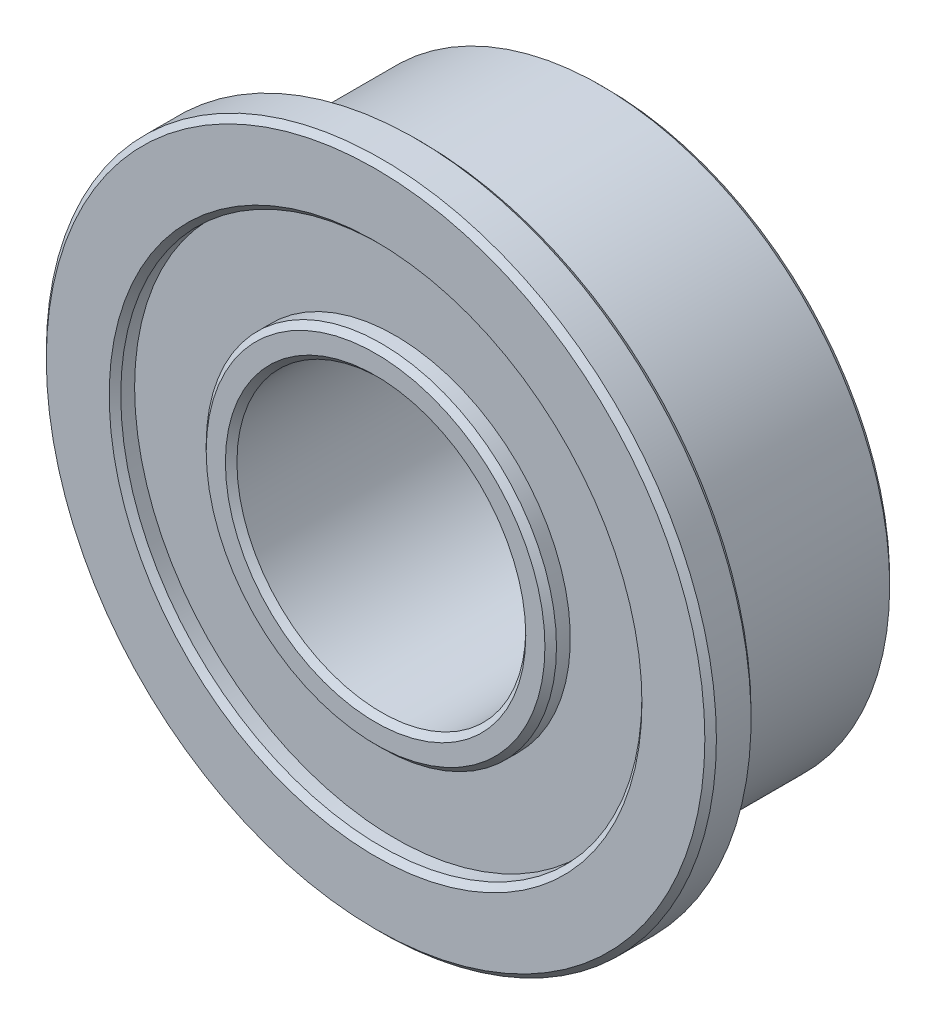
ISO-10303-21;
HEADER;
FILE_DESCRIPTION(('STEP AP214'),'2;1');
FILE_NAME('part.step','',(''),(''),'','','');
FILE_SCHEMA(('AUTOMOTIVE_DESIGN { 1 0 10303 214 1 1 1 1 }'));
ENDSEC;
DATA;
#1=APPLICATION_CONTEXT('core data for automotive mechanical design processes');
#2=APPLICATION_PROTOCOL_DEFINITION('international standard','automotive_design',2000,#1);
#3=PRODUCT_CONTEXT('',#1,'mechanical');
#4=PRODUCT('Part','Part','',(#3));
#5=PRODUCT_RELATED_PRODUCT_CATEGORY('part','',(#4));
#6=PRODUCT_DEFINITION_FORMATION('','',#4);
#7=PRODUCT_DEFINITION_CONTEXT('part definition',#1,'design');
#8=PRODUCT_DEFINITION('design','',#6,#7);
#9=PRODUCT_DEFINITION_SHAPE('','',#8);
#10=(LENGTH_UNIT() NAMED_UNIT(*) SI_UNIT(.MILLI.,.METRE.));
#11=(NAMED_UNIT(*) PLANE_ANGLE_UNIT() SI_UNIT($,.RADIAN.));
#12=(NAMED_UNIT(*) SI_UNIT($,.STERADIAN.) SOLID_ANGLE_UNIT());
#13=UNCERTAINTY_MEASURE_WITH_UNIT(LENGTH_MEASURE(1.E-05),#10,'distance_accuracy_value','');
#14=(GEOMETRIC_REPRESENTATION_CONTEXT(3) GLOBAL_UNCERTAINTY_ASSIGNED_CONTEXT((#13)) GLOBAL_UNIT_ASSIGNED_CONTEXT((#10,
#11,#12)) REPRESENTATION_CONTEXT('',''));
#15=CARTESIAN_POINT('',(0.,0.,0.));
#16=DIRECTION('',(0.,0.,1.));
#17=DIRECTION('',(1.,0.,0.));
#18=AXIS2_PLACEMENT_3D('',#15,#16,#17);
#19=CARTESIAN_POINT('',(0.,3.03183851121958,-2.));
#20=DIRECTION('',(0.,0.,-1.));
#21=DIRECTION('',(-1.,0.,0.));
#22=AXIS2_PLACEMENT_3D('',#19,#20,#21);
#23=PLANE('',#22);
#24=CARTESIAN_POINT('',(0.,0.,-2.));
#25=DIRECTION('',(0.,0.,-1.));
#26=DIRECTION('',(-1.,0.,0.));
#27=AXIS2_PLACEMENT_3D('',#24,#25,#26);
#28=CIRCLE('',#27,2.93183851121958);
#29=CARTESIAN_POINT('',(-2.93183851121958,0.,-2.));
#30=VERTEX_POINT('',#29);
#31=EDGE_CURVE('E62',#30,#30,#28,.T.);
#32=ORIENTED_EDGE('',*,*,#31,.T.);
#33=EDGE_LOOP('',(#32));
#34=FACE_BOUND('',#33,.T.);
#35=CARTESIAN_POINT('',(0.,0.,-2.));
#36=DIRECTION('',(0.,0.,-1.));
#37=DIRECTION('',(-1.,0.,0.));
#38=AXIS2_PLACEMENT_3D('',#35,#36,#37);
#39=CIRCLE('',#38,2.59999999999999);
#40=CARTESIAN_POINT('',(-2.59999999999999,0.,-2.));
#41=VERTEX_POINT('',#40);
#42=EDGE_CURVE('E65',#41,#41,#39,.F.);
#43=ORIENTED_EDGE('',*,*,#42,.T.);
#44=EDGE_LOOP('',(#43));
#45=FACE_BOUND('',#44,.T.);
#46=ADVANCED_FACE('F33',(#34,#45),#23,.T.);
#47=CARTESIAN_POINT('',(0.,0.,-19.0782719959034));
#48=DIRECTION('',(0.,0.,-1.));
#49=DIRECTION('',(-1.,0.,0.));
#50=AXIS2_PLACEMENT_3D('',#47,#48,#49);
#51=CYLINDRICAL_SURFACE('',#50,3.03183851121958);
#52=CARTESIAN_POINT('',(0.,0.,-1.9));
#53=DIRECTION('',(0.,0.,-1.));
#54=DIRECTION('',(-1.,0.,0.));
#55=AXIS2_PLACEMENT_3D('',#52,#53,#54);
#56=CIRCLE('',#55,3.03183851121958);
#57=CARTESIAN_POINT('',(-3.03183851121958,0.,-1.9));
#58=VERTEX_POINT('',#57);
#59=EDGE_CURVE('E59',#58,#58,#56,.F.);
#60=ORIENTED_EDGE('',*,*,#59,.T.);
#61=EDGE_LOOP('',(#60));
#62=FACE_BOUND('',#61,.T.);
#63=CARTESIAN_POINT('',(0.,0.,-1.6603253707757));
#64=DIRECTION('',(0.,0.,-1.));
#65=DIRECTION('',(-1.,0.,0.));
#66=AXIS2_PLACEMENT_3D('',#63,#64,#65);
#67=CIRCLE('',#66,3.03183851121958);
#68=CARTESIAN_POINT('',(-3.03183851121958,0.,-1.6603253707757));
#69=VERTEX_POINT('',#68);
#70=EDGE_CURVE('E95',#69,#69,#67,.T.);
#71=ORIENTED_EDGE('',*,*,#70,.T.);
#72=EDGE_LOOP('',(#71));
#73=FACE_BOUND('',#72,.T.);
#74=ADVANCED_FACE('F129',(#62,#73),#51,.T.);
#75=CARTESIAN_POINT('',(0.,4.51099571266411,-1.6603253707757));
#76=DIRECTION('',(0.,0.,-1.));
#77=DIRECTION('',(-1.,0.,0.));
#78=AXIS2_PLACEMENT_3D('',#75,#76,#77);
#79=PLANE('',#78);
#80=CARTESIAN_POINT('',(0.,0.,-1.6603253707757));
#81=DIRECTION('',(0.,0.,-1.));
#82=DIRECTION('',(-1.,0.,0.));
#83=AXIS2_PLACEMENT_3D('',#80,#81,#82);
#84=CIRCLE('',#83,4.51099571266411);
#85=CARTESIAN_POINT('',(-4.51099571266411,0.,-1.6603253707757));
#86=VERTEX_POINT('',#85);
#87=EDGE_CURVE('E98',#86,#86,#84,.T.);
#88=ORIENTED_EDGE('',*,*,#87,.T.);
#89=EDGE_LOOP('',(#88));
#90=FACE_BOUND('',#89,.T.);
#91=ORIENTED_EDGE('',*,*,#70,.F.);
#92=EDGE_LOOP('',(#91));
#93=FACE_BOUND('',#92,.T.);
#94=ADVANCED_FACE('F135',(#90,#93),#79,.T.);
#95=CARTESIAN_POINT('',(0.,0.,-19.0782719959034));
#96=DIRECTION('',(0.,0.,-1.));
#97=DIRECTION('',(-1.,0.,0.));
#98=AXIS2_PLACEMENT_3D('',#95,#96,#97);
#99=CYLINDRICAL_SURFACE('',#98,4.51099571266411);
#100=CARTESIAN_POINT('',(0.,0.,-1.9));
#101=DIRECTION('',(0.,0.,-1.));
#102=DIRECTION('',(-1.,0.,0.));
#103=AXIS2_PLACEMENT_3D('',#100,#101,#102);
#104=CIRCLE('',#103,4.51099571266411);
#105=CARTESIAN_POINT('',(-4.51099571266411,0.,-1.9));
#106=VERTEX_POINT('',#105);
#107=EDGE_CURVE('E74',#106,#106,#104,.T.);
#108=ORIENTED_EDGE('',*,*,#107,.T.);
#109=EDGE_LOOP('',(#108));
#110=FACE_BOUND('',#109,.T.);
#111=ORIENTED_EDGE('',*,*,#87,.F.);
#112=EDGE_LOOP('',(#111));
#113=FACE_BOUND('',#112,.T.);
#114=ADVANCED_FACE('F307',(#110,#113),#99,.F.);
#115=CARTESIAN_POINT('',(0.,5.,-2.));
#116=DIRECTION('',(0.,0.,-1.));
#117=DIRECTION('',(-1.,0.,0.));
#118=AXIS2_PLACEMENT_3D('',#115,#116,#117);
#119=PLANE('',#118);
#120=CARTESIAN_POINT('',(0.,0.,-2.));
#121=DIRECTION('',(0.,0.,-1.));
#122=DIRECTION('',(-1.,0.,0.));
#123=AXIS2_PLACEMENT_3D('',#120,#121,#122);
#124=CIRCLE('',#123,4.61099571266411);
#125=CARTESIAN_POINT('',(-4.61099571266411,0.,-2.));
#126=VERTEX_POINT('',#125);
#127=EDGE_CURVE('E68',#126,#126,#124,.F.);
#128=ORIENTED_EDGE('',*,*,#127,.T.);
#129=EDGE_LOOP('',(#128));
#130=FACE_BOUND('',#129,.T.);
#131=CARTESIAN_POINT('',(0.,0.,-2.));
#132=DIRECTION('',(0.,0.,-1.));
#133=DIRECTION('',(-1.,0.,0.));
#134=AXIS2_PLACEMENT_3D('',#131,#132,#133);
#135=CIRCLE('',#134,4.9);
#136=CARTESIAN_POINT('',(-4.9,0.,-2.));
#137=VERTEX_POINT('',#136);
#138=EDGE_CURVE('E71',#137,#137,#135,.T.);
#139=ORIENTED_EDGE('',*,*,#138,.T.);
#140=EDGE_LOOP('',(#139));
#141=FACE_BOUND('',#140,.T.);
#142=ADVANCED_FACE('F299',(#130,#141),#119,.T.);
#143=CARTESIAN_POINT('',(0.,0.,-19.0782719959034));
#144=DIRECTION('',(0.,0.,-1.));
#145=DIRECTION('',(-1.,0.,0.));
#146=AXIS2_PLACEMENT_3D('',#143,#144,#145);
#147=CYLINDRICAL_SURFACE('',#146,5.);
#148=CARTESIAN_POINT('',(0.,0.,-1.9));
#149=DIRECTION('',(0.,0.,-1.));
#150=DIRECTION('',(-1.,0.,0.));
#151=AXIS2_PLACEMENT_3D('',#148,#149,#150);
#152=CIRCLE('',#151,5.);
#153=CARTESIAN_POINT('',(-5.,0.,-1.9));
#154=VERTEX_POINT('',#153);
#155=EDGE_CURVE('E10',#154,#154,#152,.F.);
#156=ORIENTED_EDGE('',*,*,#155,.T.);
#157=EDGE_LOOP('',(#156));
#158=FACE_BOUND('',#157,.T.);
#159=CARTESIAN_POINT('',(0.,0.,1.2));
#160=DIRECTION('',(0.,0.,-1.));
#161=DIRECTION('',(-1.,0.,0.));
#162=AXIS2_PLACEMENT_3D('',#159,#160,#161);
#163=CIRCLE('',#162,5.);
#164=CARTESIAN_POINT('',(-5.,0.,1.2));
#165=VERTEX_POINT('',#164);
#166=EDGE_CURVE('E101',#165,#165,#163,.T.);
#167=ORIENTED_EDGE('',*,*,#166,.T.);
#168=EDGE_LOOP('',(#167));
#169=FACE_BOUND('',#168,.T.);
#170=ADVANCED_FACE('F290',(#158,#169),#147,.T.);
#171=CARTESIAN_POINT('',(0.,5.,1.2));
#172=DIRECTION('',(0.,0.,-1.));
#173=DIRECTION('',(-1.,0.,0.));
#174=AXIS2_PLACEMENT_3D('',#171,#172,#173);
#175=PLANE('',#174);
#176=CARTESIAN_POINT('',(0.,0.,1.2));
#177=DIRECTION('',(0.,0.,-1.));
#178=DIRECTION('',(-1.,0.,0.));
#179=AXIS2_PLACEMENT_3D('',#176,#177,#178);
#180=CIRCLE('',#179,5.70000000000001);
#181=CARTESIAN_POINT('',(-5.70000000000001,0.,1.2));
#182=VERTEX_POINT('',#181);
#183=EDGE_CURVE('E83',#182,#182,#180,.T.);
#184=ORIENTED_EDGE('',*,*,#183,.T.);
#185=EDGE_LOOP('',(#184));
#186=FACE_BOUND('',#185,.T.);
#187=ORIENTED_EDGE('',*,*,#166,.F.);
#188=EDGE_LOOP('',(#187));
#189=FACE_BOUND('',#188,.T.);
#190=ADVANCED_FACE('F281',(#186,#189),#175,.T.);
#191=CARTESIAN_POINT('',(0.,0.,-19.0782719959034));
#192=DIRECTION('',(0.,0.,-1.));
#193=DIRECTION('',(-1.,0.,0.));
#194=AXIS2_PLACEMENT_3D('',#191,#192,#193);
#195=CYLINDRICAL_SURFACE('',#194,5.8);
#196=CARTESIAN_POINT('',(0.,0.,1.3));
#197=DIRECTION('',(0.,0.,-1.));
#198=DIRECTION('',(-1.,0.,0.));
#199=AXIS2_PLACEMENT_3D('',#196,#197,#198);
#200=CIRCLE('',#199,5.8);
#201=CARTESIAN_POINT('',(-5.8,0.,1.3));
#202=VERTEX_POINT('',#201);
#203=EDGE_CURVE('E77',#202,#202,#200,.F.);
#204=ORIENTED_EDGE('',*,*,#203,.T.);
#205=EDGE_LOOP('',(#204));
#206=FACE_BOUND('',#205,.T.);
#207=CARTESIAN_POINT('',(0.,0.,1.90000000000001));
#208=DIRECTION('',(0.,0.,1.));
#209=DIRECTION('',(1.,0.,0.));
#210=AXIS2_PLACEMENT_3D('',#207,#208,#209);
#211=CIRCLE('',#210,5.8);
#212=CARTESIAN_POINT('',(5.8,0.,1.90000000000001));
#213=VERTEX_POINT('',#212);
#214=EDGE_CURVE('E80',#213,#213,#211,.F.);
#215=ORIENTED_EDGE('',*,*,#214,.T.);
#216=EDGE_LOOP('',(#215));
#217=FACE_BOUND('',#216,.T.);
#218=ADVANCED_FACE('F272',(#206,#217),#195,.T.);
#219=CARTESIAN_POINT('',(0.,5.8,2.));
#220=DIRECTION('',(0.,0.,1.));
#221=DIRECTION('',(1.,0.,0.));
#222=AXIS2_PLACEMENT_3D('',#219,#220,#221);
#223=PLANE('',#222);
#224=CARTESIAN_POINT('',(0.,0.,2.));
#225=DIRECTION('',(0.,0.,1.));
#226=DIRECTION('',(1.,0.,0.));
#227=AXIS2_PLACEMENT_3D('',#224,#225,#226);
#228=CIRCLE('',#227,4.61099571266411);
#229=CARTESIAN_POINT('',(4.61099571266411,0.,2.));
#230=VERTEX_POINT('',#229);
#231=EDGE_CURVE('E89',#230,#230,#228,.F.);
#232=ORIENTED_EDGE('',*,*,#231,.T.);
#233=EDGE_LOOP('',(#232));
#234=FACE_BOUND('',#233,.T.);
#235=CARTESIAN_POINT('',(0.,0.,2.));
#236=DIRECTION('',(0.,0.,1.));
#237=DIRECTION('',(1.,0.,0.));
#238=AXIS2_PLACEMENT_3D('',#235,#236,#237);
#239=CIRCLE('',#238,5.70000000000001);
#240=CARTESIAN_POINT('',(5.70000000000001,0.,2.));
#241=VERTEX_POINT('',#240);
#242=EDGE_CURVE('E92',#241,#241,#239,.T.);
#243=ORIENTED_EDGE('',*,*,#242,.T.);
#244=EDGE_LOOP('',(#243));
#245=FACE_BOUND('',#244,.T.);
#246=ADVANCED_FACE('F263',(#234,#245),#223,.T.);
#247=CARTESIAN_POINT('',(0.,0.,-19.0782719959034));
#248=DIRECTION('',(0.,0.,-1.));
#249=DIRECTION('',(-1.,0.,0.));
#250=AXIS2_PLACEMENT_3D('',#247,#248,#249);
#251=CYLINDRICAL_SURFACE('',#250,4.51099571266411);
#252=CARTESIAN_POINT('',(0.,0.,1.9));
#253=DIRECTION('',(0.,0.,1.));
#254=DIRECTION('',(1.,0.,0.));
#255=AXIS2_PLACEMENT_3D('',#252,#253,#254);
#256=CIRCLE('',#255,4.51099571266411);
#257=CARTESIAN_POINT('',(4.51099571266411,0.,1.9));
#258=VERTEX_POINT('',#257);
#259=EDGE_CURVE('E86',#258,#258,#256,.T.);
#260=ORIENTED_EDGE('',*,*,#259,.T.);
#261=EDGE_LOOP('',(#260));
#262=FACE_BOUND('',#261,.T.);
#263=CARTESIAN_POINT('',(0.,0.,1.6603253707757));
#264=DIRECTION('',(0.,0.,-1.));
#265=DIRECTION('',(-1.,0.,0.));
#266=AXIS2_PLACEMENT_3D('',#263,#264,#265);
#267=CIRCLE('',#266,4.51099571266411);
#268=CARTESIAN_POINT('',(-4.51099571266411,0.,1.6603253707757));
#269=VERTEX_POINT('',#268);
#270=EDGE_CURVE('E104',#269,#269,#267,.T.);
#271=ORIENTED_EDGE('',*,*,#270,.T.);
#272=EDGE_LOOP('',(#271));
#273=FACE_BOUND('',#272,.T.);
#274=ADVANCED_FACE('F126',(#262,#273),#251,.F.);
#275=CARTESIAN_POINT('',(0.,4.51099571266411,1.6603253707757));
#276=DIRECTION('',(0.,0.,1.));
#277=DIRECTION('',(1.,0.,0.));
#278=AXIS2_PLACEMENT_3D('',#275,#276,#277);
#279=PLANE('',#278);
#280=CARTESIAN_POINT('',(0.,0.,1.6603253707757));
#281=DIRECTION('',(0.,0.,-1.));
#282=DIRECTION('',(-1.,0.,0.));
#283=AXIS2_PLACEMENT_3D('',#280,#281,#282);
#284=CIRCLE('',#283,3.03183851121958);
#285=CARTESIAN_POINT('',(-3.03183851121958,0.,1.6603253707757));
#286=VERTEX_POINT('',#285);
#287=EDGE_CURVE('E107',#286,#286,#284,.T.);
#288=ORIENTED_EDGE('',*,*,#287,.T.);
#289=EDGE_LOOP('',(#288));
#290=FACE_BOUND('',#289,.T.);
#291=ORIENTED_EDGE('',*,*,#270,.F.);
#292=EDGE_LOOP('',(#291));
#293=FACE_BOUND('',#292,.T.);
#294=ADVANCED_FACE('F111',(#290,#293),#279,.T.);
#295=CARTESIAN_POINT('',(0.,0.,-19.0782719959034));
#296=DIRECTION('',(0.,0.,-1.));
#297=DIRECTION('',(-1.,0.,0.));
#298=AXIS2_PLACEMENT_3D('',#295,#296,#297);
#299=CYLINDRICAL_SURFACE('',#298,3.03183851121958);
#300=CARTESIAN_POINT('',(0.,0.,1.90000000000001));
#301=DIRECTION('',(0.,0.,1.));
#302=DIRECTION('',(1.,0.,0.));
#303=AXIS2_PLACEMENT_3D('',#300,#301,#302);
#304=CIRCLE('',#303,3.03183851121958);
#305=CARTESIAN_POINT('',(3.03183851121958,0.,1.90000000000001));
#306=VERTEX_POINT('',#305);
#307=EDGE_CURVE('E56',#306,#306,#304,.F.);
#308=ORIENTED_EDGE('',*,*,#307,.T.);
#309=EDGE_LOOP('',(#308));
#310=FACE_BOUND('',#309,.T.);
#311=ORIENTED_EDGE('',*,*,#287,.F.);
#312=EDGE_LOOP('',(#311));
#313=FACE_BOUND('',#312,.T.);
#314=ADVANCED_FACE('F114',(#310,#313),#299,.T.);
#315=CARTESIAN_POINT('',(0.,3.03183851121958,2.));
#316=DIRECTION('',(0.,0.,1.));
#317=DIRECTION('',(1.,0.,0.));
#318=AXIS2_PLACEMENT_3D('',#315,#316,#317);
#319=PLANE('',#318);
#320=CARTESIAN_POINT('',(0.,0.,2.));
#321=DIRECTION('',(0.,0.,1.));
#322=DIRECTION('',(1.,0.,0.));
#323=AXIS2_PLACEMENT_3D('',#320,#321,#322);
#324=CIRCLE('',#323,2.93183851121958);
#325=CARTESIAN_POINT('',(2.93183851121958,0.,2.));
#326=VERTEX_POINT('',#325);
#327=EDGE_CURVE('E48',#326,#326,#324,.T.);
#328=ORIENTED_EDGE('',*,*,#327,.T.);
#329=EDGE_LOOP('',(#328));
#330=FACE_BOUND('',#329,.T.);
#331=CARTESIAN_POINT('',(0.,0.,2.));
#332=DIRECTION('',(0.,0.,1.));
#333=DIRECTION('',(1.,0.,0.));
#334=AXIS2_PLACEMENT_3D('',#331,#332,#333);
#335=CIRCLE('',#334,2.59999999999999);
#336=CARTESIAN_POINT('',(2.59999999999999,0.,2.));
#337=VERTEX_POINT('',#336);
#338=EDGE_CURVE('E53',#337,#337,#335,.F.);
#339=ORIENTED_EDGE('',*,*,#338,.T.);
#340=EDGE_LOOP('',(#339));
#341=FACE_BOUND('',#340,.T.);
#342=ADVANCED_FACE('F116',(#330,#341),#319,.T.);
#343=CARTESIAN_POINT('',(0.,0.,-19.0782719959034));
#344=DIRECTION('',(0.,0.,-1.));
#345=DIRECTION('',(-1.,0.,0.));
#346=AXIS2_PLACEMENT_3D('',#343,#344,#345);
#347=CYLINDRICAL_SURFACE('',#346,2.5);
#348=CARTESIAN_POINT('',(0.,0.,-1.90000000000001));
#349=DIRECTION('',(0.,0.,-1.));
#350=DIRECTION('',(-1.,0.,0.));
#351=AXIS2_PLACEMENT_3D('',#348,#349,#350);
#352=CIRCLE('',#351,2.5);
#353=CARTESIAN_POINT('',(-2.5,0.,-1.90000000000001));
#354=VERTEX_POINT('',#353);
#355=EDGE_CURVE('E40',#354,#354,#352,.T.);
#356=ORIENTED_EDGE('',*,*,#355,.T.);
#357=EDGE_LOOP('',(#356));
#358=FACE_BOUND('',#357,.T.);
#359=CARTESIAN_POINT('',(0.,0.,1.9));
#360=DIRECTION('',(0.,0.,1.));
#361=DIRECTION('',(1.,0.,0.));
#362=AXIS2_PLACEMENT_3D('',#359,#360,#361);
#363=CIRCLE('',#362,2.5);
#364=CARTESIAN_POINT('',(2.5,0.,1.9));
#365=VERTEX_POINT('',#364);
#366=EDGE_CURVE('E44',#365,#365,#363,.T.);
#367=ORIENTED_EDGE('',*,*,#366,.T.);
#368=EDGE_LOOP('',(#367));
#369=FACE_BOUND('',#368,.T.);
#370=ADVANCED_FACE('F123',(#358,#369),#347,.F.);
#371=CARTESIAN_POINT('',(0.,0.,2.));
#372=DIRECTION('',(0.,0.,1.));
#373=DIRECTION('',(1.,0.,0.));
#374=AXIS2_PLACEMENT_3D('',#371,#372,#373);
#375=CONICAL_SURFACE('',#374,4.61099571266411,0.78539816339744);
#376=ORIENTED_EDGE('',*,*,#259,.F.);
#377=EDGE_LOOP('',(#376));
#378=FACE_BOUND('',#377,.T.);
#379=ORIENTED_EDGE('',*,*,#231,.F.);
#380=EDGE_LOOP('',(#379));
#381=FACE_BOUND('',#380,.T.);
#382=ADVANCED_FACE('F141',(#378,#381),#375,.F.);
#383=CARTESIAN_POINT('',(0.,0.,1.2));
#384=DIRECTION('',(0.,0.,1.));
#385=DIRECTION('',(1.,0.,0.));
#386=AXIS2_PLACEMENT_3D('',#383,#384,#385);
#387=CONICAL_SURFACE('',#386,5.70000000000001,0.78539816339744);
#388=ORIENTED_EDGE('',*,*,#203,.F.);
#389=EDGE_LOOP('',(#388));
#390=FACE_BOUND('',#389,.T.);
#391=ORIENTED_EDGE('',*,*,#183,.F.);
#392=EDGE_LOOP('',(#391));
#393=FACE_BOUND('',#392,.T.);
#394=ADVANCED_FACE('F144',(#390,#393),#387,.T.);
#395=CARTESIAN_POINT('',(0.,0.,1.90000000000001));
#396=DIRECTION('',(0.,0.,-1.));
#397=DIRECTION('',(-1.,0.,0.));
#398=AXIS2_PLACEMENT_3D('',#395,#396,#397);
#399=CONICAL_SURFACE('',#398,5.8,0.785398163397444);
#400=ORIENTED_EDGE('',*,*,#242,.F.);
#401=EDGE_LOOP('',(#400));
#402=FACE_BOUND('',#401,.T.);
#403=ORIENTED_EDGE('',*,*,#214,.F.);
#404=EDGE_LOOP('',(#403));
#405=FACE_BOUND('',#404,.T.);
#406=ADVANCED_FACE('F148',(#402,#405),#399,.T.);
#407=CARTESIAN_POINT('',(0.,0.,-1.9));
#408=DIRECTION('',(0.,0.,-1.));
#409=DIRECTION('',(-1.,0.,0.));
#410=AXIS2_PLACEMENT_3D('',#407,#408,#409);
#411=CONICAL_SURFACE('',#410,4.51099571266411,0.78539816339744);
#412=ORIENTED_EDGE('',*,*,#127,.F.);
#413=EDGE_LOOP('',(#412));
#414=FACE_BOUND('',#413,.T.);
#415=ORIENTED_EDGE('',*,*,#107,.F.);
#416=EDGE_LOOP('',(#415));
#417=FACE_BOUND('',#416,.T.);
#418=ADVANCED_FACE('F152',(#414,#417),#411,.F.);
#419=CARTESIAN_POINT('',(0.,0.,-2.));
#420=DIRECTION('',(0.,0.,1.));
#421=DIRECTION('',(1.,0.,0.));
#422=AXIS2_PLACEMENT_3D('',#419,#420,#421);
#423=CONICAL_SURFACE('',#422,2.93183851121958,0.785398163397422);
#424=ORIENTED_EDGE('',*,*,#59,.F.);
#425=EDGE_LOOP('',(#424));
#426=FACE_BOUND('',#425,.T.);
#427=ORIENTED_EDGE('',*,*,#31,.F.);
#428=EDGE_LOOP('',(#427));
#429=FACE_BOUND('',#428,.T.);
#430=ADVANCED_FACE('F156',(#426,#429),#423,.T.);
#431=CARTESIAN_POINT('',(0.,0.,1.90000000000001));
#432=DIRECTION('',(0.,0.,-1.));
#433=DIRECTION('',(-1.,0.,0.));
#434=AXIS2_PLACEMENT_3D('',#431,#432,#433);
#435=CONICAL_SURFACE('',#434,3.03183851121958,0.785398163397442);
#436=ORIENTED_EDGE('',*,*,#327,.F.);
#437=EDGE_LOOP('',(#436));
#438=FACE_BOUND('',#437,.T.);
#439=ORIENTED_EDGE('',*,*,#307,.F.);
#440=EDGE_LOOP('',(#439));
#441=FACE_BOUND('',#440,.T.);
#442=ADVANCED_FACE('F160',(#438,#441),#435,.T.);
#443=CARTESIAN_POINT('',(0.,0.,-1.90000000000001));
#444=DIRECTION('',(0.,0.,-1.));
#445=DIRECTION('',(-1.,0.,0.));
#446=AXIS2_PLACEMENT_3D('',#443,#444,#445);
#447=CONICAL_SURFACE('',#446,2.5,0.785398163397448);
#448=ORIENTED_EDGE('',*,*,#42,.F.);
#449=EDGE_LOOP('',(#448));
#450=FACE_BOUND('',#449,.T.);
#451=ORIENTED_EDGE('',*,*,#355,.F.);
#452=EDGE_LOOP('',(#451));
#453=FACE_BOUND('',#452,.T.);
#454=ADVANCED_FACE('F164',(#450,#453),#447,.F.);
#455=CARTESIAN_POINT('',(0.,0.,2.));
#456=DIRECTION('',(0.,0.,1.));
#457=DIRECTION('',(1.,0.,0.));
#458=AXIS2_PLACEMENT_3D('',#455,#456,#457);
#459=CONICAL_SURFACE('',#458,2.6,0.785398163397431);
#460=ORIENTED_EDGE('',*,*,#366,.F.);
#461=EDGE_LOOP('',(#460));
#462=FACE_BOUND('',#461,.T.);
#463=ORIENTED_EDGE('',*,*,#338,.F.);
#464=EDGE_LOOP('',(#463));
#465=FACE_BOUND('',#464,.T.);
#466=ADVANCED_FACE('F167',(#462,#465),#459,.F.);
#467=CARTESIAN_POINT('',(0.,0.,-2.));
#468=DIRECTION('',(0.,0.,1.));
#469=DIRECTION('',(1.,0.,0.));
#470=AXIS2_PLACEMENT_3D('',#467,#468,#469);
#471=CONICAL_SURFACE('',#470,4.9,0.785398163397431);
#472=ORIENTED_EDGE('',*,*,#155,.F.);
#473=EDGE_LOOP('',(#472));
#474=FACE_BOUND('',#473,.T.);
#475=ORIENTED_EDGE('',*,*,#138,.F.);
#476=EDGE_LOOP('',(#475));
#477=FACE_BOUND('',#476,.T.);
#478=ADVANCED_FACE('F35',(#474,#477),#471,.T.);
#479=CLOSED_SHELL('',(#46,#74,#94,#114,#142,#170,#190,#218,#246,#274,#294,#314,#342,#370,#382,
#394,#406,#418,#430,#442,#454,#466,#478));
#480=MANIFOLD_SOLID_BREP('B2',#479);
#481=ADVANCED_BREP_SHAPE_REPRESENTATION('',(#18,#480),#14);
#482=SHAPE_DEFINITION_REPRESENTATION(#9,#481);
ENDSEC;
END-ISO-10303-21;
